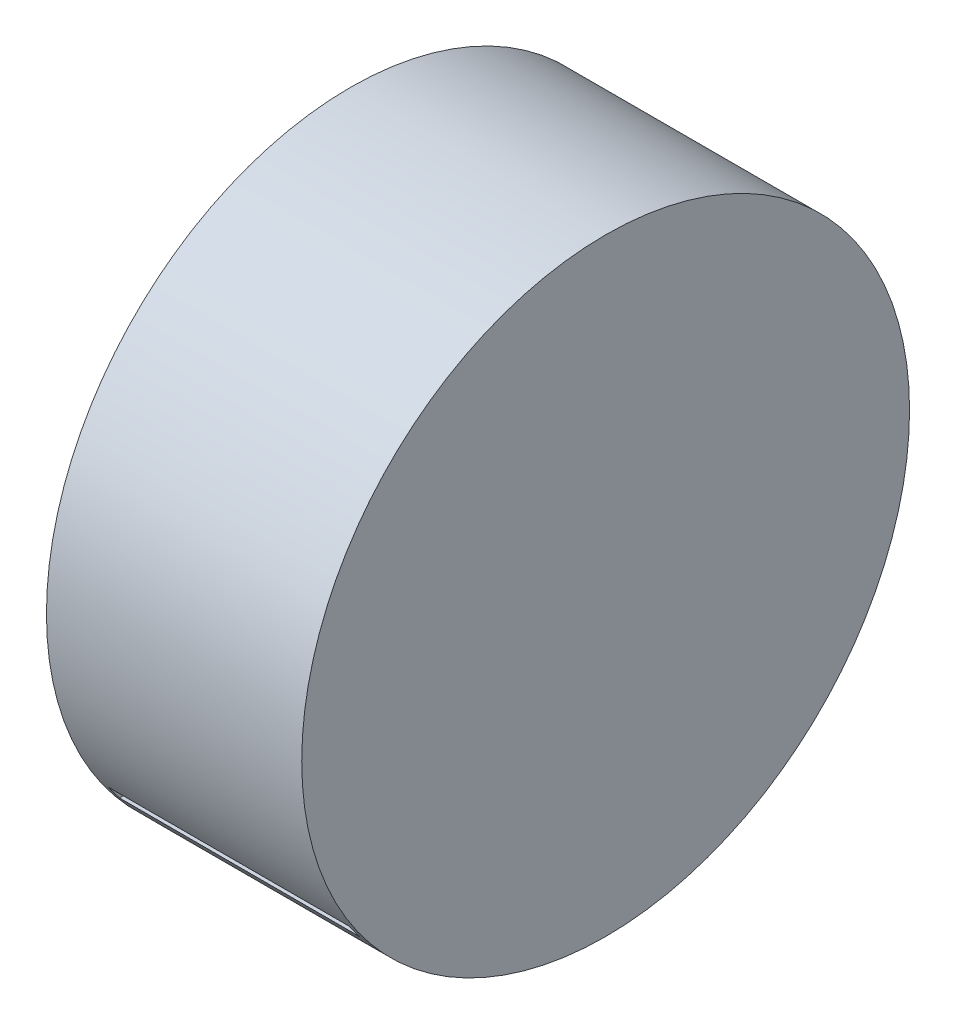
ISO-10303-21;
HEADER;
FILE_DESCRIPTION(('STEP AP214'),'2;1');
FILE_NAME('part.step','',(''),(''),'','','');
FILE_SCHEMA(('AUTOMOTIVE_DESIGN { 1 0 10303 214 1 1 1 1 }'));
ENDSEC;
DATA;
#1=APPLICATION_CONTEXT('core data for automotive mechanical design processes');
#2=APPLICATION_PROTOCOL_DEFINITION('international standard','automotive_design',2000,#1);
#3=PRODUCT_CONTEXT('',#1,'mechanical');
#4=PRODUCT('Part','Part','',(#3));
#5=PRODUCT_RELATED_PRODUCT_CATEGORY('part','',(#4));
#6=PRODUCT_DEFINITION_FORMATION('','',#4);
#7=PRODUCT_DEFINITION_CONTEXT('part definition',#1,'design');
#8=PRODUCT_DEFINITION('design','',#6,#7);
#9=PRODUCT_DEFINITION_SHAPE('','',#8);
#10=(LENGTH_UNIT() NAMED_UNIT(*) SI_UNIT(.MILLI.,.METRE.));
#11=(NAMED_UNIT(*) PLANE_ANGLE_UNIT() SI_UNIT($,.RADIAN.));
#12=(NAMED_UNIT(*) SI_UNIT($,.STERADIAN.) SOLID_ANGLE_UNIT());
#13=UNCERTAINTY_MEASURE_WITH_UNIT(LENGTH_MEASURE(1.E-05),#10,'distance_accuracy_value','');
#14=(GEOMETRIC_REPRESENTATION_CONTEXT(3) GLOBAL_UNCERTAINTY_ASSIGNED_CONTEXT((#13)) GLOBAL_UNIT_ASSIGNED_CONTEXT((#10,
#11,#12)) REPRESENTATION_CONTEXT('',''));
#15=CARTESIAN_POINT('',(0.,0.,0.));
#16=DIRECTION('',(0.,0.,1.));
#17=DIRECTION('',(1.,0.,0.));
#18=AXIS2_PLACEMENT_3D('',#15,#16,#17);
#19=CARTESIAN_POINT('',(4.2,0.,0.));
#20=DIRECTION('',(1.,0.,0.));
#21=DIRECTION('',(0.,0.,-1.));
#22=AXIS2_PLACEMENT_3D('',#19,#20,#21);
#23=PLANE('',#22);
#24=CARTESIAN_POINT('',(4.2,0.,0.));
#25=DIRECTION('',(-1.,0.,0.));
#26=DIRECTION('',(0.,0.,1.));
#27=AXIS2_PLACEMENT_3D('',#24,#25,#26);
#28=CIRCLE('',#27,10.);
#29=CARTESIAN_POINT('',(4.2,0.,10.));
#30=VERTEX_POINT('',#29);
#31=EDGE_CURVE('E174',#30,#30,#28,.T.);
#32=ORIENTED_EDGE('',*,*,#31,.F.);
#33=EDGE_LOOP('',(#32));
#34=FACE_BOUND('',#33,.T.);
#35=ADVANCED_FACE('F17',(#34),#23,.T.);
#36=CARTESIAN_POINT('',(-4.2,0.,0.));
#37=DIRECTION('',(-1.,0.,0.));
#38=DIRECTION('',(0.,0.,1.));
#39=AXIS2_PLACEMENT_3D('',#36,#37,#38);
#40=PLANE('',#39);
#41=CARTESIAN_POINT('',(-4.2,0.,0.));
#42=DIRECTION('',(1.,0.,0.));
#43=DIRECTION('',(0.,0.,-1.));
#44=AXIS2_PLACEMENT_3D('',#41,#42,#43);
#45=CIRCLE('',#44,10.);
#46=CARTESIAN_POINT('',(-4.2,0.,-10.));
#47=VERTEX_POINT('',#46);
#48=EDGE_CURVE('E170',#47,#47,#45,.T.);
#49=ORIENTED_EDGE('',*,*,#48,.F.);
#50=EDGE_LOOP('',(#49));
#51=FACE_BOUND('',#50,.T.);
#52=ADVANCED_FACE('F238',(#51),#40,.T.);
#53=CARTESIAN_POINT('',(-4.2,0.,0.));
#54=DIRECTION('',(1.,0.,0.));
#55=DIRECTION('',(0.,0.,-1.));
#56=AXIS2_PLACEMENT_3D('',#53,#54,#55);
#57=CYLINDRICAL_SURFACE('',#56,10.);
#58=DIRECTION('',(1.,0.,0.));
#59=VECTOR('',#58,1.);
#60=CARTESIAN_POINT('',(-4.2,-6.2,-7.84601809837321));
#61=LINE('',#60,#59);
#62=CARTESIAN_POINT('',(3.95,-6.2,-7.84601809837321));
#63=VERTEX_POINT('',#62);
#64=CARTESIAN_POINT('',(-3.95,-6.2,-7.84601809837321));
#65=VERTEX_POINT('',#64);
#66=EDGE_CURVE('E155',#63,#65,#61,.F.);
#67=ORIENTED_EDGE('',*,*,#66,.F.);
#68=CARTESIAN_POINT('',(3.95,0.,0.));
#69=DIRECTION('',(1.,0.,0.));
#70=DIRECTION('',(0.,0.,-1.));
#71=AXIS2_PLACEMENT_3D('',#68,#69,#70);
#72=CIRCLE('',#71,10.);
#73=CARTESIAN_POINT('',(3.95,-5.72363520850168,-8.2));
#74=VERTEX_POINT('',#73);
#75=EDGE_CURVE('E202',#74,#63,#72,.F.);
#76=ORIENTED_EDGE('',*,*,#75,.F.);
#77=DIRECTION('',(1.,0.,0.));
#78=VECTOR('',#77,1.);
#79=CARTESIAN_POINT('',(-4.2,-5.72363520850168,-8.2));
#80=LINE('',#79,#78);
#81=CARTESIAN_POINT('',(-3.95,-5.72363520850168,-8.2));
#82=VERTEX_POINT('',#81);
#83=EDGE_CURVE('E21',#82,#74,#80,.T.);
#84=ORIENTED_EDGE('',*,*,#83,.F.);
#85=CARTESIAN_POINT('',(-3.95,0.,0.));
#86=DIRECTION('',(-1.,0.,0.));
#87=DIRECTION('',(0.,0.,1.));
#88=AXIS2_PLACEMENT_3D('',#85,#86,#87);
#89=CIRCLE('',#88,10.);
#90=EDGE_CURVE('E11',#65,#82,#89,.F.);
#91=ORIENTED_EDGE('',*,*,#90,.F.);
#92=EDGE_LOOP('',(#67,#76,#84,#91));
#93=FACE_BOUND('',#92,.T.);
#94=CARTESIAN_POINT('',(-3.95,-5.72363520850168,8.2));
#95=VERTEX_POINT('',#94);
#96=CARTESIAN_POINT('',(-3.95,-6.2,7.84601809837321));
#97=VERTEX_POINT('',#96);
#98=EDGE_CURVE('E27',#95,#97,#89,.F.);
#99=ORIENTED_EDGE('',*,*,#98,.F.);
#100=DIRECTION('',(1.,0.,0.));
#101=VECTOR('',#100,1.);
#102=CARTESIAN_POINT('',(-4.2,-5.72363520850168,8.2));
#103=LINE('',#102,#101);
#104=CARTESIAN_POINT('',(3.95,-5.72363520850168,8.2));
#105=VERTEX_POINT('',#104);
#106=EDGE_CURVE('E201',#105,#95,#103,.F.);
#107=ORIENTED_EDGE('',*,*,#106,.F.);
#108=CARTESIAN_POINT('',(3.95,-6.2,7.84601809837321));
#109=VERTEX_POINT('',#108);
#110=EDGE_CURVE('E198',#109,#105,#72,.F.);
#111=ORIENTED_EDGE('',*,*,#110,.F.);
#112=DIRECTION('',(1.,0.,0.));
#113=VECTOR('',#112,1.);
#114=CARTESIAN_POINT('',(-4.2,-6.2,7.84601809837321));
#115=LINE('',#114,#113);
#116=EDGE_CURVE('E152',#97,#109,#115,.T.);
#117=ORIENTED_EDGE('',*,*,#116,.F.);
#118=EDGE_LOOP('',(#99,#107,#111,#117));
#119=FACE_BOUND('',#118,.T.);
#120=DIRECTION('',(1.,0.,0.));
#121=VECTOR('',#120,1.);
#122=CARTESIAN_POINT('',(-4.2,-6.93974062915899,7.2));
#123=LINE('',#122,#121);
#124=CARTESIAN_POINT('',(3.2,-6.93974062915899,7.2));
#125=VERTEX_POINT('',#124);
#126=CARTESIAN_POINT('',(-3.2,-6.93974062915899,7.2));
#127=VERTEX_POINT('',#126);
#128=EDGE_CURVE('E190',#125,#127,#123,.F.);
#129=ORIENTED_EDGE('',*,*,#128,.F.);
#130=CARTESIAN_POINT('',(3.2,0.,0.));
#131=DIRECTION('',(1.,0.,0.));
#132=DIRECTION('',(0.,0.,-1.));
#133=AXIS2_PLACEMENT_3D('',#130,#131,#132);
#134=CIRCLE('',#133,10.);
#135=CARTESIAN_POINT('',(3.2,-6.93974062915899,-7.2));
#136=VERTEX_POINT('',#135);
#137=EDGE_CURVE('E178',#136,#125,#134,.F.);
#138=ORIENTED_EDGE('',*,*,#137,.F.);
#139=DIRECTION('',(1.,0.,0.));
#140=VECTOR('',#139,1.);
#141=CARTESIAN_POINT('',(-4.2,-6.93974062915899,-7.2));
#142=LINE('',#141,#140);
#143=CARTESIAN_POINT('',(-3.2,-6.93974062915899,-7.2));
#144=VERTEX_POINT('',#143);
#145=EDGE_CURVE('E182',#144,#136,#142,.T.);
#146=ORIENTED_EDGE('',*,*,#145,.F.);
#147=CARTESIAN_POINT('',(-3.2,0.,0.));
#148=DIRECTION('',(-1.,0.,0.));
#149=DIRECTION('',(0.,0.,1.));
#150=AXIS2_PLACEMENT_3D('',#147,#148,#149);
#151=CIRCLE('',#150,10.);
#152=EDGE_CURVE('E186',#127,#144,#151,.F.);
#153=ORIENTED_EDGE('',*,*,#152,.F.);
#154=EDGE_LOOP('',(#129,#138,#146,#153));
#155=FACE_BOUND('',#154,.T.);
#156=ORIENTED_EDGE('',*,*,#31,.T.);
#157=EDGE_LOOP('',(#156));
#158=FACE_BOUND('',#157,.T.);
#159=ORIENTED_EDGE('',*,*,#48,.T.);
#160=EDGE_LOOP('',(#159));
#161=FACE_BOUND('',#160,.T.);
#162=ADVANCED_FACE('F19',(#93,#119,#155,#158,#161),#57,.T.);
#163=CARTESIAN_POINT('',(0.,-6.5,7.2));
#164=DIRECTION('',(0.,0.,1.));
#165=DIRECTION('',(1.,0.,0.));
#166=AXIS2_PLACEMENT_3D('',#163,#164,#165);
#167=PLANE('',#166);
#168=DIRECTION('',(0.,1.,0.));
#169=VECTOR('',#168,1.);
#170=CARTESIAN_POINT('',(-3.2,-6.5,7.2));
#171=LINE('',#170,#169);
#172=CARTESIAN_POINT('',(-3.2,-6.2,7.2));
#173=VERTEX_POINT('',#172);
#174=EDGE_CURVE('E167',#127,#173,#171,.T.);
#175=ORIENTED_EDGE('',*,*,#174,.T.);
#176=DIRECTION('',(1.,0.,0.));
#177=VECTOR('',#176,1.);
#178=CARTESIAN_POINT('',(0.,-6.2,7.2));
#179=LINE('',#178,#177);
#180=CARTESIAN_POINT('',(3.2,-6.2,7.2));
#181=VERTEX_POINT('',#180);
#182=EDGE_CURVE('E148',#173,#181,#179,.T.);
#183=ORIENTED_EDGE('',*,*,#182,.T.);
#184=DIRECTION('',(0.,-1.,0.));
#185=VECTOR('',#184,1.);
#186=CARTESIAN_POINT('',(3.2,-6.5,7.2));
#187=LINE('',#186,#185);
#188=EDGE_CURVE('E163',#181,#125,#187,.T.);
#189=ORIENTED_EDGE('',*,*,#188,.T.);
#190=ORIENTED_EDGE('',*,*,#128,.T.);
#191=EDGE_LOOP('',(#175,#183,#189,#190));
#192=FACE_BOUND('',#191,.T.);
#193=ADVANCED_FACE('F246',(#192),#167,.F.);
#194=CARTESIAN_POINT('',(-3.2,-6.5,-7.2));
#195=DIRECTION('',(-1.,0.,0.));
#196=DIRECTION('',(0.,0.,1.));
#197=AXIS2_PLACEMENT_3D('',#194,#195,#196);
#198=PLANE('',#197);
#199=DIRECTION('',(0.,-1.,0.));
#200=VECTOR('',#199,1.);
#201=CARTESIAN_POINT('',(-3.2,-6.5,-7.2));
#202=LINE('',#201,#200);
#203=CARTESIAN_POINT('',(-3.2,-6.2,-7.2));
#204=VERTEX_POINT('',#203);
#205=EDGE_CURVE('E158',#204,#144,#202,.T.);
#206=ORIENTED_EDGE('',*,*,#205,.F.);
#207=DIRECTION('',(0.,0.,1.));
#208=VECTOR('',#207,1.);
#209=CARTESIAN_POINT('',(-3.2,-6.2,-7.2));
#210=LINE('',#209,#208);
#211=EDGE_CURVE('E144',#204,#173,#210,.T.);
#212=ORIENTED_EDGE('',*,*,#211,.T.);
#213=ORIENTED_EDGE('',*,*,#174,.F.);
#214=ORIENTED_EDGE('',*,*,#152,.T.);
#215=EDGE_LOOP('',(#206,#212,#213,#214));
#216=FACE_BOUND('',#215,.T.);
#217=ADVANCED_FACE('F249',(#216),#198,.F.);
#218=CARTESIAN_POINT('',(0.,-6.5,-7.2));
#219=DIRECTION('',(0.,0.,-1.));
#220=DIRECTION('',(-1.,0.,0.));
#221=AXIS2_PLACEMENT_3D('',#218,#219,#220);
#222=PLANE('',#221);
#223=DIRECTION('',(0.,1.,0.));
#224=VECTOR('',#223,1.);
#225=CARTESIAN_POINT('',(3.2,-6.5,-7.2));
#226=LINE('',#225,#224);
#227=CARTESIAN_POINT('',(3.2,-6.2,-7.2));
#228=VERTEX_POINT('',#227);
#229=EDGE_CURVE('E159',#136,#228,#226,.T.);
#230=ORIENTED_EDGE('',*,*,#229,.T.);
#231=DIRECTION('',(-1.,0.,0.));
#232=VECTOR('',#231,1.);
#233=CARTESIAN_POINT('',(0.,-6.2,-7.2));
#234=LINE('',#233,#232);
#235=EDGE_CURVE('E140',#228,#204,#234,.T.);
#236=ORIENTED_EDGE('',*,*,#235,.T.);
#237=ORIENTED_EDGE('',*,*,#205,.T.);
#238=ORIENTED_EDGE('',*,*,#145,.T.);
#239=EDGE_LOOP('',(#230,#236,#237,#238));
#240=FACE_BOUND('',#239,.T.);
#241=ADVANCED_FACE('F253',(#240),#222,.F.);
#242=CARTESIAN_POINT('',(3.2,-6.5,-7.2));
#243=DIRECTION('',(1.,0.,0.));
#244=DIRECTION('',(0.,0.,-1.));
#245=AXIS2_PLACEMENT_3D('',#242,#243,#244);
#246=PLANE('',#245);
#247=ORIENTED_EDGE('',*,*,#188,.F.);
#248=DIRECTION('',(0.,0.,-1.));
#249=VECTOR('',#248,1.);
#250=CARTESIAN_POINT('',(3.2,-6.2,-7.2));
#251=LINE('',#250,#249);
#252=EDGE_CURVE('E194',#181,#228,#251,.T.);
#253=ORIENTED_EDGE('',*,*,#252,.T.);
#254=ORIENTED_EDGE('',*,*,#229,.F.);
#255=ORIENTED_EDGE('',*,*,#137,.T.);
#256=EDGE_LOOP('',(#247,#253,#254,#255));
#257=FACE_BOUND('',#256,.T.);
#258=ADVANCED_FACE('F234',(#257),#246,.F.);
#259=CARTESIAN_POINT('',(0.,-6.2,-8.2));
#260=DIRECTION('',(0.,-1.,0.));
#261=DIRECTION('',(0.,0.,-1.));
#262=AXIS2_PLACEMENT_3D('',#259,#260,#261);
#263=PLANE('',#262);
#264=ORIENTED_EDGE('',*,*,#66,.T.);
#265=DIRECTION('',(0.,0.,1.));
#266=VECTOR('',#265,1.);
#267=CARTESIAN_POINT('',(-3.95,-6.2,-8.2));
#268=LINE('',#267,#266);
#269=EDGE_CURVE('E128',#65,#97,#268,.T.);
#270=ORIENTED_EDGE('',*,*,#269,.T.);
#271=ORIENTED_EDGE('',*,*,#116,.T.);
#272=DIRECTION('',(0.,0.,1.));
#273=VECTOR('',#272,1.);
#274=CARTESIAN_POINT('',(3.95,-6.2,-8.2));
#275=LINE('',#274,#273);
#276=EDGE_CURVE('E40',#63,#109,#275,.T.);
#277=ORIENTED_EDGE('',*,*,#276,.F.);
#278=EDGE_LOOP('',(#264,#270,#271,#277));
#279=FACE_BOUND('',#278,.T.);
#280=ORIENTED_EDGE('',*,*,#211,.F.);
#281=ORIENTED_EDGE('',*,*,#235,.F.);
#282=ORIENTED_EDGE('',*,*,#252,.F.);
#283=ORIENTED_EDGE('',*,*,#182,.F.);
#284=EDGE_LOOP('',(#280,#281,#282,#283));
#285=FACE_BOUND('',#284,.T.);
#286=ADVANCED_FACE('F216',(#279,#285),#263,.F.);
#287=CARTESIAN_POINT('',(0.,-2.,8.2));
#288=DIRECTION('',(0.,0.,1.));
#289=DIRECTION('',(1.,0.,0.));
#290=AXIS2_PLACEMENT_3D('',#287,#288,#289);
#291=PLANE('',#290);
#292=ORIENTED_EDGE('',*,*,#106,.T.);
#293=DIRECTION('',(0.,1.,0.));
#294=VECTOR('',#293,1.);
#295=CARTESIAN_POINT('',(-3.95,-2.,8.2));
#296=LINE('',#295,#294);
#297=CARTESIAN_POINT('',(-3.95,2.2,8.2));
#298=VERTEX_POINT('',#297);
#299=EDGE_CURVE('E137',#95,#298,#296,.T.);
#300=ORIENTED_EDGE('',*,*,#299,.T.);
#301=DIRECTION('',(1.,0.,0.));
#302=VECTOR('',#301,1.);
#303=CARTESIAN_POINT('',(0.,2.2,8.2));
#304=LINE('',#303,#302);
#305=CARTESIAN_POINT('',(3.95,2.2,8.2));
#306=VERTEX_POINT('',#305);
#307=EDGE_CURVE('E134',#298,#306,#304,.T.);
#308=ORIENTED_EDGE('',*,*,#307,.T.);
#309=DIRECTION('',(0.,-1.,0.));
#310=VECTOR('',#309,1.);
#311=CARTESIAN_POINT('',(3.95,-2.,8.2));
#312=LINE('',#311,#310);
#313=EDGE_CURVE('E107',#306,#105,#312,.T.);
#314=ORIENTED_EDGE('',*,*,#313,.T.);
#315=EDGE_LOOP('',(#292,#300,#308,#314));
#316=FACE_BOUND('',#315,.T.);
#317=ADVANCED_FACE('F226',(#316),#291,.F.);
#318=CARTESIAN_POINT('',(-3.95,-2.,-8.2));
#319=DIRECTION('',(-1.,0.,0.));
#320=DIRECTION('',(0.,0.,1.));
#321=AXIS2_PLACEMENT_3D('',#318,#319,#320);
#322=PLANE('',#321);
#323=ORIENTED_EDGE('',*,*,#98,.T.);
#324=ORIENTED_EDGE('',*,*,#269,.F.);
#325=ORIENTED_EDGE('',*,*,#90,.T.);
#326=DIRECTION('',(0.,-1.,0.));
#327=VECTOR('',#326,1.);
#328=CARTESIAN_POINT('',(-3.95,-2.,-8.2));
#329=LINE('',#328,#327);
#330=CARTESIAN_POINT('',(-3.95,2.2,-8.2));
#331=VERTEX_POINT('',#330);
#332=EDGE_CURVE('E116',#331,#82,#329,.T.);
#333=ORIENTED_EDGE('',*,*,#332,.F.);
#334=DIRECTION('',(0.,0.,1.));
#335=VECTOR('',#334,1.);
#336=CARTESIAN_POINT('',(-3.95,2.2,-8.2));
#337=LINE('',#336,#335);
#338=EDGE_CURVE('E111',#331,#298,#337,.T.);
#339=ORIENTED_EDGE('',*,*,#338,.T.);
#340=ORIENTED_EDGE('',*,*,#299,.F.);
#341=EDGE_LOOP('',(#323,#324,#325,#333,#339,#340));
#342=FACE_BOUND('',#341,.T.);
#343=ADVANCED_FACE('F222',(#342),#322,.F.);
#344=CARTESIAN_POINT('',(0.,2.2,-8.2));
#345=DIRECTION('',(0.,1.,0.));
#346=DIRECTION('',(0.,0.,1.));
#347=AXIS2_PLACEMENT_3D('',#344,#345,#346);
#348=PLANE('',#347);
#349=ORIENTED_EDGE('',*,*,#338,.F.);
#350=DIRECTION('',(-1.,0.,0.));
#351=VECTOR('',#350,1.);
#352=CARTESIAN_POINT('',(0.,2.2,-8.2));
#353=LINE('',#352,#351);
#354=CARTESIAN_POINT('',(3.95,2.2,-8.2));
#355=VERTEX_POINT('',#354);
#356=EDGE_CURVE('E96',#355,#331,#353,.T.);
#357=ORIENTED_EDGE('',*,*,#356,.F.);
#358=DIRECTION('',(0.,0.,1.));
#359=VECTOR('',#358,1.);
#360=CARTESIAN_POINT('',(3.95,2.2,-8.2));
#361=LINE('',#360,#359);
#362=EDGE_CURVE('E104',#355,#306,#361,.T.);
#363=ORIENTED_EDGE('',*,*,#362,.T.);
#364=ORIENTED_EDGE('',*,*,#307,.F.);
#365=EDGE_LOOP('',(#349,#357,#363,#364));
#366=FACE_BOUND('',#365,.T.);
#367=ADVANCED_FACE('F113',(#366),#348,.F.);
#368=CARTESIAN_POINT('',(0.,-2.,-8.2));
#369=DIRECTION('',(0.,0.,-1.));
#370=DIRECTION('',(-1.,0.,0.));
#371=AXIS2_PLACEMENT_3D('',#368,#369,#370);
#372=PLANE('',#371);
#373=ORIENTED_EDGE('',*,*,#83,.T.);
#374=DIRECTION('',(0.,1.,0.));
#375=VECTOR('',#374,1.);
#376=CARTESIAN_POINT('',(3.95,-2.,-8.2));
#377=LINE('',#376,#375);
#378=EDGE_CURVE('E34',#74,#355,#377,.T.);
#379=ORIENTED_EDGE('',*,*,#378,.T.);
#380=ORIENTED_EDGE('',*,*,#356,.T.);
#381=ORIENTED_EDGE('',*,*,#332,.T.);
#382=EDGE_LOOP('',(#373,#379,#380,#381));
#383=FACE_BOUND('',#382,.T.);
#384=ADVANCED_FACE('F93',(#383),#372,.F.);
#385=CARTESIAN_POINT('',(3.95,-2.,-8.2));
#386=DIRECTION('',(1.,0.,0.));
#387=DIRECTION('',(0.,0.,-1.));
#388=AXIS2_PLACEMENT_3D('',#385,#386,#387);
#389=PLANE('',#388);
#390=ORIENTED_EDGE('',*,*,#75,.T.);
#391=ORIENTED_EDGE('',*,*,#276,.T.);
#392=ORIENTED_EDGE('',*,*,#110,.T.);
#393=ORIENTED_EDGE('',*,*,#313,.F.);
#394=ORIENTED_EDGE('',*,*,#362,.F.);
#395=ORIENTED_EDGE('',*,*,#378,.F.);
#396=EDGE_LOOP('',(#390,#391,#392,#393,#394,#395));
#397=FACE_BOUND('',#396,.T.);
#398=ADVANCED_FACE('F105',(#397),#389,.F.);
#399=CLOSED_SHELL('',(#35,#52,#162,#193,#217,#241,#258,#286,#317,#343,#367,#384,#398));
#400=MANIFOLD_SOLID_BREP('B1',#399);
#401=ADVANCED_BREP_SHAPE_REPRESENTATION('',(#18,#400),#14);
#402=SHAPE_DEFINITION_REPRESENTATION(#9,#401);
ENDSEC;
END-ISO-10303-21;
